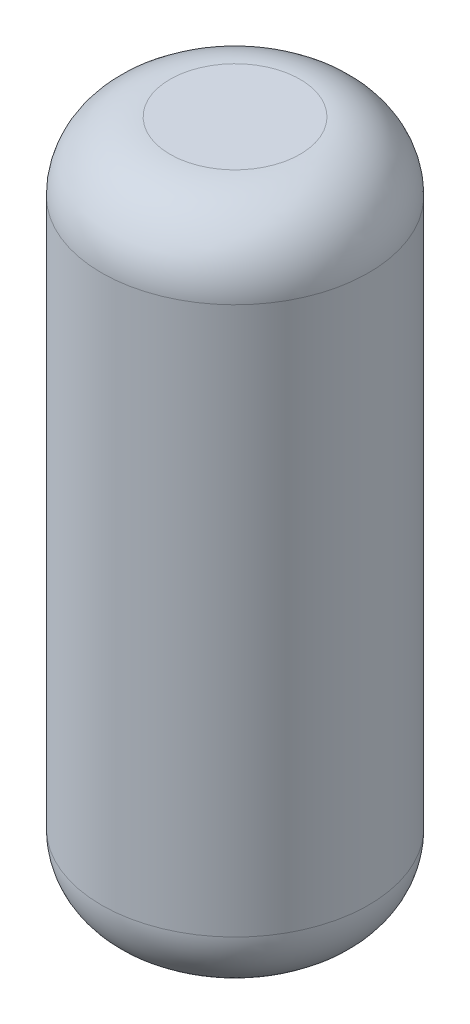
ISO-10303-21;
HEADER;
FILE_DESCRIPTION(('STEP AP214'),'2;1');
FILE_NAME('part.step','',(''),(''),'','','');
FILE_SCHEMA(('AUTOMOTIVE_DESIGN { 1 0 10303 214 1 1 1 1 }'));
ENDSEC;
DATA;
#1=APPLICATION_CONTEXT('core data for automotive mechanical design processes');
#2=APPLICATION_PROTOCOL_DEFINITION('international standard','automotive_design',2000,#1);
#3=PRODUCT_CONTEXT('',#1,'mechanical');
#4=PRODUCT('Part','Part','',(#3));
#5=PRODUCT_RELATED_PRODUCT_CATEGORY('part','',(#4));
#6=PRODUCT_DEFINITION_FORMATION('','',#4);
#7=PRODUCT_DEFINITION_CONTEXT('part definition',#1,'design');
#8=PRODUCT_DEFINITION('design','',#6,#7);
#9=PRODUCT_DEFINITION_SHAPE('','',#8);
#10=(LENGTH_UNIT() NAMED_UNIT(*) SI_UNIT(.MILLI.,.METRE.));
#11=(NAMED_UNIT(*) PLANE_ANGLE_UNIT() SI_UNIT($,.RADIAN.));
#12=(NAMED_UNIT(*) SI_UNIT($,.STERADIAN.) SOLID_ANGLE_UNIT());
#13=UNCERTAINTY_MEASURE_WITH_UNIT(LENGTH_MEASURE(1.E-05),#10,'distance_accuracy_value','');
#14=(GEOMETRIC_REPRESENTATION_CONTEXT(3) GLOBAL_UNCERTAINTY_ASSIGNED_CONTEXT((#13)) GLOBAL_UNIT_ASSIGNED_CONTEXT((#10,
#11,#12)) REPRESENTATION_CONTEXT('',''));
#15=CARTESIAN_POINT('',(0.,0.,0.));
#16=DIRECTION('',(0.,0.,1.));
#17=DIRECTION('',(1.,0.,0.));
#18=AXIS2_PLACEMENT_3D('',#15,#16,#17);
#19=CARTESIAN_POINT('',(0.,10.,0.));
#20=DIRECTION('',(0.,-1.,0.));
#21=DIRECTION('',(0.,0.,-1.));
#22=AXIS2_PLACEMENT_3D('',#19,#20,#21);
#23=CYLINDRICAL_SURFACE('',#22,1.95);
#24=CARTESIAN_POINT('',(0.,9.,0.));
#25=DIRECTION('',(0.,1.,0.));
#26=DIRECTION('',(0.,0.,1.));
#27=AXIS2_PLACEMENT_3D('',#24,#25,#26);
#28=CIRCLE('',#27,1.95);
#29=CARTESIAN_POINT('',(0.,9.,1.95));
#30=VERTEX_POINT('',#29);
#31=EDGE_CURVE('E38',#30,#30,#28,.F.);
#32=ORIENTED_EDGE('',*,*,#31,.T.);
#33=EDGE_LOOP('',(#32));
#34=FACE_BOUND('',#33,.T.);
#35=CARTESIAN_POINT('',(0.,0.999999999999999,0.));
#36=DIRECTION('',(0.,1.,0.));
#37=DIRECTION('',(0.,0.,1.));
#38=AXIS2_PLACEMENT_3D('',#35,#36,#37);
#39=CIRCLE('',#38,1.95);
#40=CARTESIAN_POINT('',(0.,0.999999999999999,1.95));
#41=VERTEX_POINT('',#40);
#42=EDGE_CURVE('E42',#41,#41,#39,.T.);
#43=ORIENTED_EDGE('',*,*,#42,.T.);
#44=EDGE_LOOP('',(#43));
#45=FACE_BOUND('',#44,.T.);
#46=ADVANCED_FACE('F31',(#34,#45),#23,.T.);
#47=CARTESIAN_POINT('',(0.,10.,0.));
#48=DIRECTION('',(0.,1.,0.));
#49=DIRECTION('',(0.,0.,1.));
#50=AXIS2_PLACEMENT_3D('',#47,#48,#49);
#51=PLANE('',#50);
#52=CARTESIAN_POINT('',(0.,10.,0.));
#53=DIRECTION('',(0.,1.,0.));
#54=DIRECTION('',(0.,0.,1.));
#55=AXIS2_PLACEMENT_3D('',#52,#53,#54);
#56=CIRCLE('',#55,0.95);
#57=CARTESIAN_POINT('',(0.,10.,0.95));
#58=VERTEX_POINT('',#57);
#59=EDGE_CURVE('E46',#58,#58,#56,.T.);
#60=ORIENTED_EDGE('',*,*,#59,.T.);
#61=EDGE_LOOP('',(#60));
#62=FACE_BOUND('',#61,.T.);
#63=ADVANCED_FACE('F52',(#62),#51,.T.);
#64=CARTESIAN_POINT('',(0.,0.,0.));
#65=DIRECTION('',(0.,1.,0.));
#66=DIRECTION('',(0.,0.,1.));
#67=AXIS2_PLACEMENT_3D('',#64,#65,#66);
#68=PLANE('',#67);
#69=CARTESIAN_POINT('',(0.,0.,0.));
#70=DIRECTION('',(0.,1.,0.));
#71=DIRECTION('',(0.,0.,1.));
#72=AXIS2_PLACEMENT_3D('',#69,#70,#71);
#73=CIRCLE('',#72,0.95);
#74=CARTESIAN_POINT('',(0.,0.,0.95));
#75=VERTEX_POINT('',#74);
#76=EDGE_CURVE('E10',#75,#75,#73,.F.);
#77=ORIENTED_EDGE('',*,*,#76,.T.);
#78=EDGE_LOOP('',(#77));
#79=FACE_BOUND('',#78,.T.);
#80=ADVANCED_FACE('F56',(#79),#68,.F.);
#81=CARTESIAN_POINT('',(0.,9.,0.));
#82=DIRECTION('',(0.,1.,0.));
#83=DIRECTION('',(0.,0.,1.));
#84=AXIS2_PLACEMENT_3D('',#81,#82,#83);
#85=DEGENERATE_TOROIDAL_SURFACE('',#84,0.95,1.,.T.);
#86=ORIENTED_EDGE('',*,*,#31,.F.);
#87=EDGE_LOOP('',(#86));
#88=FACE_BOUND('',#87,.T.);
#89=ORIENTED_EDGE('',*,*,#59,.F.);
#90=EDGE_LOOP('',(#89));
#91=FACE_BOUND('',#90,.T.);
#92=ADVANCED_FACE('F54',(#88,#91),#85,.T.);
#93=CARTESIAN_POINT('',(0.,0.999999999999999,0.));
#94=DIRECTION('',(0.,1.,0.));
#95=DIRECTION('',(0.,0.,1.));
#96=AXIS2_PLACEMENT_3D('',#93,#94,#95);
#97=DEGENERATE_TOROIDAL_SURFACE('',#96,0.95,1.,.T.);
#98=ORIENTED_EDGE('',*,*,#76,.F.);
#99=EDGE_LOOP('',(#98));
#100=FACE_BOUND('',#99,.T.);
#101=ORIENTED_EDGE('',*,*,#42,.F.);
#102=EDGE_LOOP('',(#101));
#103=FACE_BOUND('',#102,.T.);
#104=ADVANCED_FACE('F33',(#100,#103),#97,.T.);
#105=CLOSED_SHELL('',(#46,#63,#80,#92,#104));
#106=MANIFOLD_SOLID_BREP('B2',#105);
#107=ADVANCED_BREP_SHAPE_REPRESENTATION('',(#18,#106),#14);
#108=SHAPE_DEFINITION_REPRESENTATION(#9,#107);
ENDSEC;
END-ISO-10303-21;
